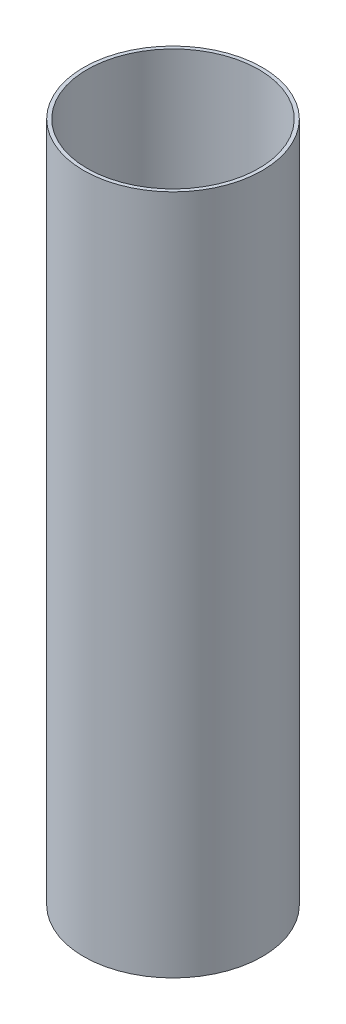
ISO-10303-21;
HEADER;
FILE_DESCRIPTION(('STEP AP214'),'2;1');
FILE_NAME('part.step','',(''),(''),'','','');
FILE_SCHEMA(('AUTOMOTIVE_DESIGN { 1 0 10303 214 1 1 1 1 }'));
ENDSEC;
DATA;
#1=APPLICATION_CONTEXT('core data for automotive mechanical design processes');
#2=APPLICATION_PROTOCOL_DEFINITION('international standard','automotive_design',2000,#1);
#3=PRODUCT_CONTEXT('',#1,'mechanical');
#4=PRODUCT('Part','Part','',(#3));
#5=PRODUCT_RELATED_PRODUCT_CATEGORY('part','',(#4));
#6=PRODUCT_DEFINITION_FORMATION('','',#4);
#7=PRODUCT_DEFINITION_CONTEXT('part definition',#1,'design');
#8=PRODUCT_DEFINITION('design','',#6,#7);
#9=PRODUCT_DEFINITION_SHAPE('','',#8);
#10=(LENGTH_UNIT() NAMED_UNIT(*) SI_UNIT(.MILLI.,.METRE.));
#11=(NAMED_UNIT(*) PLANE_ANGLE_UNIT() SI_UNIT($,.RADIAN.));
#12=(NAMED_UNIT(*) SI_UNIT($,.STERADIAN.) SOLID_ANGLE_UNIT());
#13=UNCERTAINTY_MEASURE_WITH_UNIT(LENGTH_MEASURE(1.E-05),#10,'distance_accuracy_value','');
#14=(GEOMETRIC_REPRESENTATION_CONTEXT(3) GLOBAL_UNCERTAINTY_ASSIGNED_CONTEXT((#13)) GLOBAL_UNIT_ASSIGNED_CONTEXT((#10,
#11,#12)) REPRESENTATION_CONTEXT('',''));
#15=CARTESIAN_POINT('',(0.,0.,0.));
#16=DIRECTION('',(0.,0.,1.));
#17=DIRECTION('',(1.,0.,0.));
#18=AXIS2_PLACEMENT_3D('',#15,#16,#17);
#19=CARTESIAN_POINT('',(0.,381.,0.));
#20=DIRECTION('',(0.,1.,0.));
#21=DIRECTION('',(0.,0.,1.));
#22=AXIS2_PLACEMENT_3D('',#19,#20,#21);
#23=PLANE('',#22);
#24=CARTESIAN_POINT('',(0.,381.,0.));
#25=DIRECTION('',(0.,1.,0.));
#26=DIRECTION('',(0.,0.,1.));
#27=AXIS2_PLACEMENT_3D('',#24,#25,#26);
#28=CIRCLE('',#27,50.);
#29=CARTESIAN_POINT('',(0.,381.,50.));
#30=VERTEX_POINT('',#29);
#31=EDGE_CURVE('E10',#30,#30,#28,.T.);
#32=ORIENTED_EDGE('',*,*,#31,.T.);
#33=EDGE_LOOP('',(#32));
#34=FACE_BOUND('',#33,.T.);
#35=CARTESIAN_POINT('',(0.,381.,0.));
#36=DIRECTION('',(0.,1.,0.));
#37=DIRECTION('',(0.,0.,1.));
#38=AXIS2_PLACEMENT_3D('',#35,#36,#37);
#39=CIRCLE('',#38,48.);
#40=CARTESIAN_POINT('',(0.,381.,48.));
#41=VERTEX_POINT('',#40);
#42=EDGE_CURVE('E43',#41,#41,#39,.T.);
#43=ORIENTED_EDGE('',*,*,#42,.F.);
#44=EDGE_LOOP('',(#43));
#45=FACE_BOUND('',#44,.T.);
#46=ADVANCED_FACE('F32',(#34,#45),#23,.T.);
#47=CARTESIAN_POINT('',(0.,0.,0.));
#48=DIRECTION('',(0.,1.,0.));
#49=DIRECTION('',(0.,0.,1.));
#50=AXIS2_PLACEMENT_3D('',#47,#48,#49);
#51=PLANE('',#50);
#52=CARTESIAN_POINT('',(0.,0.,0.));
#53=DIRECTION('',(0.,1.,0.));
#54=DIRECTION('',(0.,0.,1.));
#55=AXIS2_PLACEMENT_3D('',#52,#53,#54);
#56=CIRCLE('',#55,50.);
#57=CARTESIAN_POINT('',(0.,0.,50.));
#58=VERTEX_POINT('',#57);
#59=EDGE_CURVE('E36',#58,#58,#56,.T.);
#60=ORIENTED_EDGE('',*,*,#59,.F.);
#61=EDGE_LOOP('',(#60));
#62=FACE_BOUND('',#61,.T.);
#63=CARTESIAN_POINT('',(0.,0.,0.));
#64=DIRECTION('',(0.,1.,0.));
#65=DIRECTION('',(0.,0.,1.));
#66=AXIS2_PLACEMENT_3D('',#63,#64,#65);
#67=CIRCLE('',#66,48.);
#68=CARTESIAN_POINT('',(0.,0.,48.));
#69=VERTEX_POINT('',#68);
#70=EDGE_CURVE('E45',#69,#69,#67,.T.);
#71=ORIENTED_EDGE('',*,*,#70,.T.);
#72=EDGE_LOOP('',(#71));
#73=FACE_BOUND('',#72,.T.);
#74=ADVANCED_FACE('F55',(#62,#73),#51,.F.);
#75=CARTESIAN_POINT('',(0.,381.,0.));
#76=DIRECTION('',(0.,-1.,0.));
#77=DIRECTION('',(0.,0.,-1.));
#78=AXIS2_PLACEMENT_3D('',#75,#76,#77);
#79=CYLINDRICAL_SURFACE('',#78,50.);
#80=ORIENTED_EDGE('',*,*,#31,.F.);
#81=EDGE_LOOP('',(#80));
#82=FACE_BOUND('',#81,.T.);
#83=ORIENTED_EDGE('',*,*,#59,.T.);
#84=EDGE_LOOP('',(#83));
#85=FACE_BOUND('',#84,.T.);
#86=ADVANCED_FACE('F34',(#82,#85),#79,.T.);
#87=CARTESIAN_POINT('',(0.,381.,0.));
#88=DIRECTION('',(0.,-1.,0.));
#89=DIRECTION('',(0.,0.,-1.));
#90=AXIS2_PLACEMENT_3D('',#87,#88,#89);
#91=CYLINDRICAL_SURFACE('',#90,48.);
#92=ORIENTED_EDGE('',*,*,#42,.T.);
#93=EDGE_LOOP('',(#92));
#94=FACE_BOUND('',#93,.T.);
#95=ORIENTED_EDGE('',*,*,#70,.F.);
#96=EDGE_LOOP('',(#95));
#97=FACE_BOUND('',#96,.T.);
#98=ADVANCED_FACE('F51',(#94,#97),#91,.F.);
#99=CLOSED_SHELL('',(#46,#74,#86,#98));
#100=MANIFOLD_SOLID_BREP('B2',#99);
#101=ADVANCED_BREP_SHAPE_REPRESENTATION('',(#18,#100),#14);
#102=SHAPE_DEFINITION_REPRESENTATION(#9,#101);
ENDSEC;
END-ISO-10303-21;
